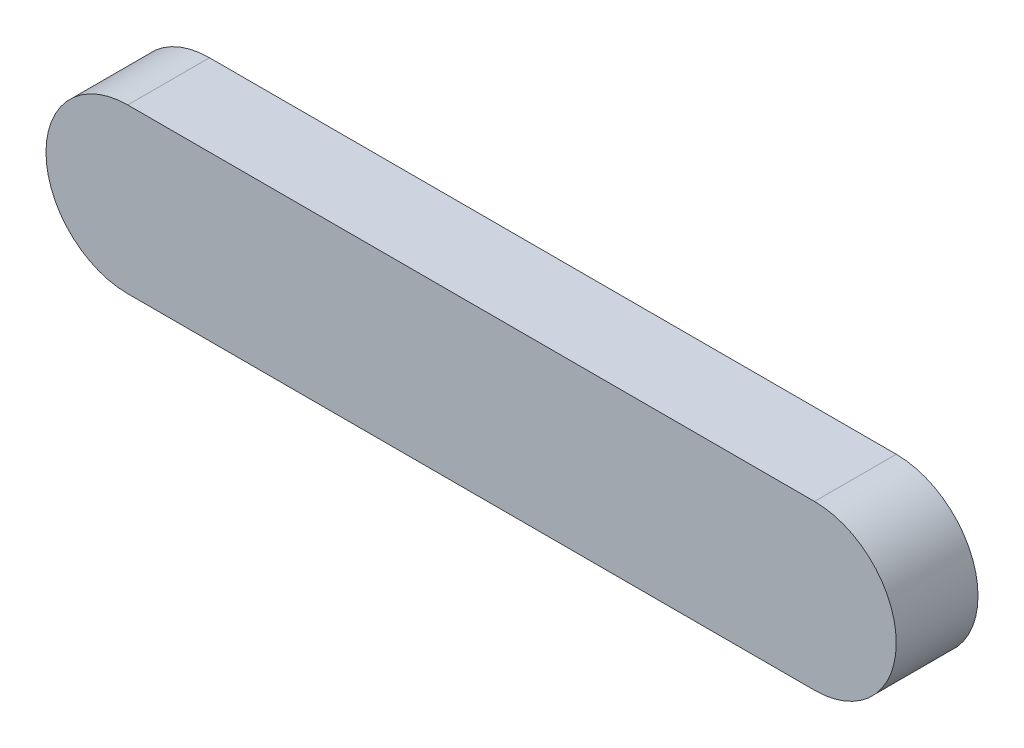
ISO-10303-21;
HEADER;
FILE_DESCRIPTION(('STEP AP214'),'2;1');
FILE_NAME('part.step','',(''),(''),'','','');
FILE_SCHEMA(('AUTOMOTIVE_DESIGN { 1 0 10303 214 1 1 1 1 }'));
ENDSEC;
DATA;
#1=APPLICATION_CONTEXT('core data for automotive mechanical design processes');
#2=APPLICATION_PROTOCOL_DEFINITION('international standard','automotive_design',2000,#1);
#3=PRODUCT_CONTEXT('',#1,'mechanical');
#4=PRODUCT('Part','Part','',(#3));
#5=PRODUCT_RELATED_PRODUCT_CATEGORY('part','',(#4));
#6=PRODUCT_DEFINITION_FORMATION('','',#4);
#7=PRODUCT_DEFINITION_CONTEXT('part definition',#1,'design');
#8=PRODUCT_DEFINITION('design','',#6,#7);
#9=PRODUCT_DEFINITION_SHAPE('','',#8);
#10=(LENGTH_UNIT() NAMED_UNIT(*) SI_UNIT(.MILLI.,.METRE.));
#11=(NAMED_UNIT(*) PLANE_ANGLE_UNIT() SI_UNIT($,.RADIAN.));
#12=(NAMED_UNIT(*) SI_UNIT($,.STERADIAN.) SOLID_ANGLE_UNIT());
#13=UNCERTAINTY_MEASURE_WITH_UNIT(LENGTH_MEASURE(1.E-05),#10,'distance_accuracy_value','');
#14=(GEOMETRIC_REPRESENTATION_CONTEXT(3) GLOBAL_UNCERTAINTY_ASSIGNED_CONTEXT((#13)) GLOBAL_UNIT_ASSIGNED_CONTEXT((#10,
#11,#12)) REPRESENTATION_CONTEXT('',''));
#15=CARTESIAN_POINT('',(0.,0.,0.));
#16=DIRECTION('',(0.,0.,1.));
#17=DIRECTION('',(1.,0.,0.));
#18=AXIS2_PLACEMENT_3D('',#15,#16,#17);
#19=CARTESIAN_POINT('',(-21.,0.,2.5));
#20=DIRECTION('',(0.,0.,-1.));
#21=DIRECTION('',(-1.,0.,0.));
#22=AXIS2_PLACEMENT_3D('',#19,#20,#21);
#23=CYLINDRICAL_SURFACE('',#22,5.00000000000001);
#24=CARTESIAN_POINT('',(-21.,0.,-2.5));
#25=DIRECTION('',(0.,0.,1.));
#26=DIRECTION('',(1.,0.,0.));
#27=AXIS2_PLACEMENT_3D('',#24,#25,#26);
#28=CIRCLE('',#27,5.00000000000001);
#29=CARTESIAN_POINT('',(-21.,5.00000000000001,-2.5));
#30=VERTEX_POINT('',#29);
#31=CARTESIAN_POINT('',(-21.,-5.00000000000001,-2.5));
#32=VERTEX_POINT('',#31);
#33=EDGE_CURVE('E113',#30,#32,#28,.T.);
#34=ORIENTED_EDGE('',*,*,#33,.T.);
#35=DIRECTION('',(0.,0.,-1.));
#36=VECTOR('',#35,1.);
#37=CARTESIAN_POINT('',(-21.,-5.00000000000001,2.5));
#38=LINE('',#37,#36);
#39=CARTESIAN_POINT('',(-21.,-5.00000000000001,2.5));
#40=VERTEX_POINT('',#39);
#41=EDGE_CURVE('E11',#40,#32,#38,.T.);
#42=ORIENTED_EDGE('',*,*,#41,.F.);
#43=CARTESIAN_POINT('',(-21.,0.,2.5));
#44=DIRECTION('',(0.,0.,1.));
#45=DIRECTION('',(1.,0.,0.));
#46=AXIS2_PLACEMENT_3D('',#43,#44,#45);
#47=CIRCLE('',#46,5.00000000000001);
#48=CARTESIAN_POINT('',(-21.,5.00000000000001,2.5));
#49=VERTEX_POINT('',#48);
#50=EDGE_CURVE('E97',#49,#40,#47,.T.);
#51=ORIENTED_EDGE('',*,*,#50,.F.);
#52=DIRECTION('',(0.,0.,-1.));
#53=VECTOR('',#52,1.);
#54=CARTESIAN_POINT('',(-21.,5.00000000000001,2.5));
#55=LINE('',#54,#53);
#56=EDGE_CURVE('E109',#49,#30,#55,.T.);
#57=ORIENTED_EDGE('',*,*,#56,.T.);
#58=EDGE_LOOP('',(#34,#42,#51,#57));
#59=FACE_BOUND('',#58,.T.);
#60=ADVANCED_FACE('F45',(#59),#23,.T.);
#61=CARTESIAN_POINT('',(-21.,-5.00000000000001,2.5));
#62=DIRECTION('',(0.,1.,0.));
#63=DIRECTION('',(-1.,0.,0.));
#64=AXIS2_PLACEMENT_3D('',#61,#62,#63);
#65=PLANE('',#64);
#66=DIRECTION('',(1.,0.,0.));
#67=VECTOR('',#66,1.);
#68=CARTESIAN_POINT('',(-21.,-5.00000000000001,-2.5));
#69=LINE('',#68,#67);
#70=CARTESIAN_POINT('',(21.,-5.00000000000001,-2.5));
#71=VERTEX_POINT('',#70);
#72=EDGE_CURVE('E102',#32,#71,#69,.T.);
#73=ORIENTED_EDGE('',*,*,#72,.T.);
#74=DIRECTION('',(0.,0.,-1.));
#75=VECTOR('',#74,1.);
#76=CARTESIAN_POINT('',(21.,-5.00000000000001,2.5));
#77=LINE('',#76,#75);
#78=CARTESIAN_POINT('',(21.,-5.00000000000001,2.5));
#79=VERTEX_POINT('',#78);
#80=EDGE_CURVE('E54',#79,#71,#77,.T.);
#81=ORIENTED_EDGE('',*,*,#80,.F.);
#82=DIRECTION('',(1.,0.,0.));
#83=VECTOR('',#82,1.);
#84=CARTESIAN_POINT('',(-21.,-5.00000000000001,2.5));
#85=LINE('',#84,#83);
#86=EDGE_CURVE('E92',#40,#79,#85,.T.);
#87=ORIENTED_EDGE('',*,*,#86,.F.);
#88=ORIENTED_EDGE('',*,*,#41,.T.);
#89=EDGE_LOOP('',(#73,#81,#87,#88));
#90=FACE_BOUND('',#89,.T.);
#91=ADVANCED_FACE('F101',(#90),#65,.F.);
#92=CARTESIAN_POINT('',(21.,0.,2.5));
#93=DIRECTION('',(0.,0.,-1.));
#94=DIRECTION('',(-1.,0.,0.));
#95=AXIS2_PLACEMENT_3D('',#92,#93,#94);
#96=CYLINDRICAL_SURFACE('',#95,5.00000000000001);
#97=CARTESIAN_POINT('',(21.,0.,-2.5));
#98=DIRECTION('',(0.,0.,1.));
#99=DIRECTION('',(1.,0.,0.));
#100=AXIS2_PLACEMENT_3D('',#97,#98,#99);
#101=CIRCLE('',#100,5.00000000000001);
#102=CARTESIAN_POINT('',(21.,5.00000000000002,-2.5));
#103=VERTEX_POINT('',#102);
#104=EDGE_CURVE('E79',#71,#103,#101,.T.);
#105=ORIENTED_EDGE('',*,*,#104,.T.);
#106=DIRECTION('',(0.,0.,-1.));
#107=VECTOR('',#106,1.);
#108=CARTESIAN_POINT('',(21.,5.00000000000002,2.5));
#109=LINE('',#108,#107);
#110=CARTESIAN_POINT('',(21.,5.00000000000002,2.5));
#111=VERTEX_POINT('',#110);
#112=EDGE_CURVE('E104',#111,#103,#109,.T.);
#113=ORIENTED_EDGE('',*,*,#112,.F.);
#114=CARTESIAN_POINT('',(21.,0.,2.5));
#115=DIRECTION('',(0.,0.,1.));
#116=DIRECTION('',(1.,0.,0.));
#117=AXIS2_PLACEMENT_3D('',#114,#115,#116);
#118=CIRCLE('',#117,5.00000000000001);
#119=EDGE_CURVE('E95',#79,#111,#118,.T.);
#120=ORIENTED_EDGE('',*,*,#119,.F.);
#121=ORIENTED_EDGE('',*,*,#80,.T.);
#122=EDGE_LOOP('',(#105,#113,#120,#121));
#123=FACE_BOUND('',#122,.T.);
#124=ADVANCED_FACE('F105',(#123),#96,.T.);
#125=CARTESIAN_POINT('',(-21.,5.00000000000001,2.5));
#126=DIRECTION('',(0.,-1.,0.));
#127=DIRECTION('',(1.,0.,0.));
#128=AXIS2_PLACEMENT_3D('',#125,#126,#127);
#129=PLANE('',#128);
#130=DIRECTION('',(-1.,0.,0.));
#131=VECTOR('',#130,1.);
#132=CARTESIAN_POINT('',(-21.,5.00000000000001,-2.5));
#133=LINE('',#132,#131);
#134=EDGE_CURVE('E85',#103,#30,#133,.T.);
#135=ORIENTED_EDGE('',*,*,#134,.T.);
#136=ORIENTED_EDGE('',*,*,#56,.F.);
#137=DIRECTION('',(-1.,0.,0.));
#138=VECTOR('',#137,1.);
#139=CARTESIAN_POINT('',(-21.,5.00000000000001,2.5));
#140=LINE('',#139,#138);
#141=EDGE_CURVE('E62',#111,#49,#140,.T.);
#142=ORIENTED_EDGE('',*,*,#141,.F.);
#143=ORIENTED_EDGE('',*,*,#112,.T.);
#144=EDGE_LOOP('',(#135,#136,#142,#143));
#145=FACE_BOUND('',#144,.T.);
#146=ADVANCED_FACE('F126',(#145),#129,.F.);
#147=CARTESIAN_POINT('',(-21.,0.,2.5));
#148=DIRECTION('',(0.,0.,1.));
#149=DIRECTION('',(1.,0.,0.));
#150=AXIS2_PLACEMENT_3D('',#147,#148,#149);
#151=PLANE('',#150);
#152=ORIENTED_EDGE('',*,*,#50,.T.);
#153=ORIENTED_EDGE('',*,*,#86,.T.);
#154=ORIENTED_EDGE('',*,*,#119,.T.);
#155=ORIENTED_EDGE('',*,*,#141,.T.);
#156=EDGE_LOOP('',(#152,#153,#154,#155));
#157=FACE_BOUND('',#156,.T.);
#158=ADVANCED_FACE('F93',(#157),#151,.T.);
#159=CARTESIAN_POINT('',(-21.,0.,-2.5));
#160=DIRECTION('',(0.,0.,1.));
#161=DIRECTION('',(1.,0.,0.));
#162=AXIS2_PLACEMENT_3D('',#159,#160,#161);
#163=PLANE('',#162);
#164=ORIENTED_EDGE('',*,*,#33,.F.);
#165=ORIENTED_EDGE('',*,*,#134,.F.);
#166=ORIENTED_EDGE('',*,*,#104,.F.);
#167=ORIENTED_EDGE('',*,*,#72,.F.);
#168=EDGE_LOOP('',(#164,#165,#166,#167));
#169=FACE_BOUND('',#168,.T.);
#170=ADVANCED_FACE('F129',(#169),#163,.F.);
#171=CLOSED_SHELL('',(#60,#91,#124,#146,#158,#170));
#172=MANIFOLD_SOLID_BREP('B2',#171);
#173=ADVANCED_BREP_SHAPE_REPRESENTATION('',(#18,#172),#14);
#174=SHAPE_DEFINITION_REPRESENTATION(#9,#173);
ENDSEC;
END-ISO-10303-21;
